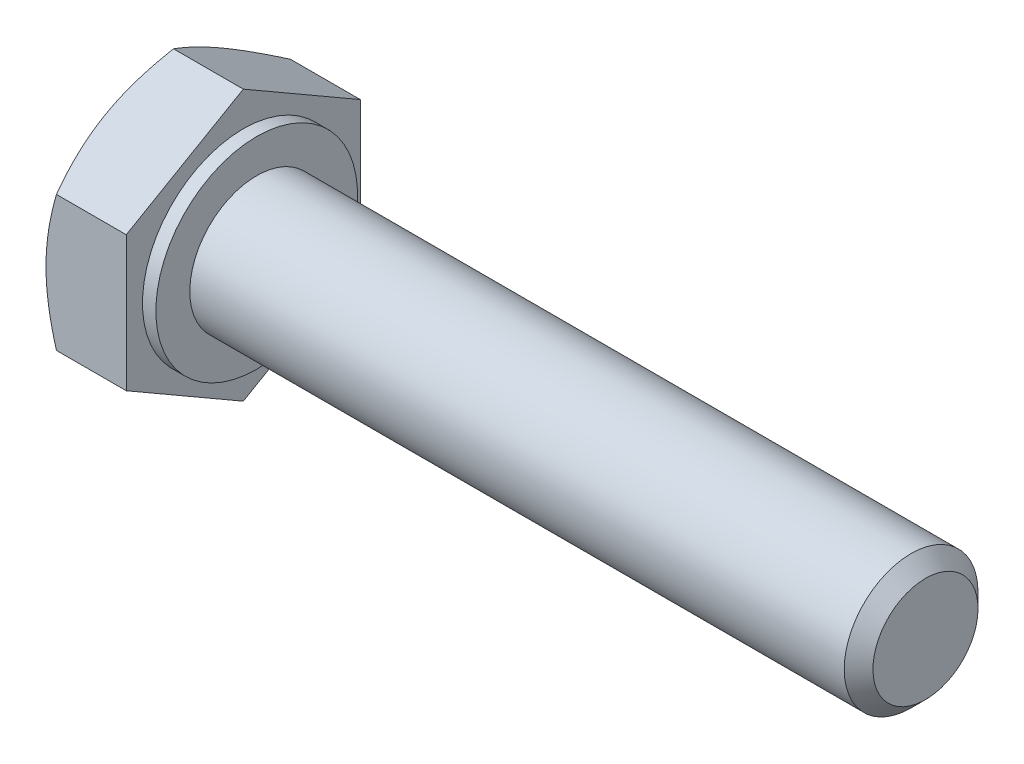
ISO-10303-21;
HEADER;
FILE_DESCRIPTION(('STEP AP214'),'2;1');
FILE_NAME('part.step','',(''),(''),'','','');
FILE_SCHEMA(('AUTOMOTIVE_DESIGN { 1 0 10303 214 1 1 1 1 }'));
ENDSEC;
DATA;
#1=APPLICATION_CONTEXT('core data for automotive mechanical design processes');
#2=APPLICATION_PROTOCOL_DEFINITION('international standard','automotive_design',2000,#1);
#3=PRODUCT_CONTEXT('',#1,'mechanical');
#4=PRODUCT('Part','Part','',(#3));
#5=PRODUCT_RELATED_PRODUCT_CATEGORY('part','',(#4));
#6=PRODUCT_DEFINITION_FORMATION('','',#4);
#7=PRODUCT_DEFINITION_CONTEXT('part definition',#1,'design');
#8=PRODUCT_DEFINITION('design','',#6,#7);
#9=PRODUCT_DEFINITION_SHAPE('','',#8);
#10=(LENGTH_UNIT() NAMED_UNIT(*) SI_UNIT(.MILLI.,.METRE.));
#11=(NAMED_UNIT(*) PLANE_ANGLE_UNIT() SI_UNIT($,.RADIAN.));
#12=(NAMED_UNIT(*) SI_UNIT($,.STERADIAN.) SOLID_ANGLE_UNIT());
#13=UNCERTAINTY_MEASURE_WITH_UNIT(LENGTH_MEASURE(1.E-05),#10,'distance_accuracy_value','');
#14=(GEOMETRIC_REPRESENTATION_CONTEXT(3) GLOBAL_UNCERTAINTY_ASSIGNED_CONTEXT((#13)) GLOBAL_UNIT_ASSIGNED_CONTEXT((#10,
#11,#12)) REPRESENTATION_CONTEXT('',''));
#15=CARTESIAN_POINT('',(0.,0.,0.));
#16=DIRECTION('',(0.,0.,1.));
#17=DIRECTION('',(1.,0.,0.));
#18=AXIS2_PLACEMENT_3D('',#15,#16,#17);
#19=CARTESIAN_POINT('',(0.,2.5075,0.));
#20=DIRECTION('',(1.,0.,0.));
#21=DIRECTION('',(0.,1.,0.));
#22=AXIS2_PLACEMENT_3D('',#19,#20,#21);
#23=PLANE('',#22);
#24=CARTESIAN_POINT('',(0.,0.,0.));
#25=DIRECTION('',(1.,0.,0.));
#26=DIRECTION('',(0.,1.,0.));
#27=AXIS2_PLACEMENT_3D('',#24,#25,#26);
#28=CIRCLE('',#27,2.);
#29=CARTESIAN_POINT('',(0.,-2.,0.));
#30=VERTEX_POINT('',#29);
#31=EDGE_CURVE('E249',#30,#30,#28,.T.);
#32=ORIENTED_EDGE('',*,*,#31,.F.);
#33=EDGE_LOOP('',(#32));
#34=FACE_BOUND('',#33,.T.);
#35=CARTESIAN_POINT('',(0.,0.,0.));
#36=DIRECTION('',(1.,0.,0.));
#37=DIRECTION('',(0.,1.,0.));
#38=AXIS2_PLACEMENT_3D('',#35,#36,#37);
#39=CIRCLE('',#38,3.015);
#40=CARTESIAN_POINT('',(0.,-3.015,0.));
#41=VERTEX_POINT('',#40);
#42=EDGE_CURVE('E30',#41,#41,#39,.T.);
#43=ORIENTED_EDGE('',*,*,#42,.T.);
#44=EDGE_LOOP('',(#43));
#45=FACE_BOUND('',#44,.T.);
#46=ADVANCED_FACE('F17',(#34,#45),#23,.T.);
#47=CARTESIAN_POINT('',(-0.200049999999994,0.,0.));
#48=DIRECTION('',(1.,0.,0.));
#49=DIRECTION('',(0.,1.,0.));
#50=AXIS2_PLACEMENT_3D('',#47,#48,#49);
#51=CYLINDRICAL_SURFACE('',#50,3.015);
#52=ORIENTED_EDGE('',*,*,#42,.F.);
#53=DIRECTION('',(-1.,0.,0.));
#54=VECTOR('',#53,1.);
#55=CARTESIAN_POINT('',(-0.200049999999994,-3.015,0.));
#56=LINE('',#55,#54);
#57=CARTESIAN_POINT('',(-0.400099999999993,-3.015,0.));
#58=VERTEX_POINT('',#57);
#59=EDGE_CURVE('E11',#41,#58,#56,.T.);
#60=ORIENTED_EDGE('',*,*,#59,.T.);
#61=CARTESIAN_POINT('',(-0.400099999999992,0.,0.));
#62=DIRECTION('',(1.,0.,0.));
#63=DIRECTION('',(0.,1.,0.));
#64=AXIS2_PLACEMENT_3D('',#61,#62,#63);
#65=CIRCLE('',#64,3.015);
#66=EDGE_CURVE('E162',#58,#58,#65,.T.);
#67=ORIENTED_EDGE('',*,*,#66,.T.);
#68=ORIENTED_EDGE('',*,*,#59,.F.);
#69=EDGE_LOOP('',(#52,#60,#67,#68));
#70=FACE_BOUND('',#69,.T.);
#71=ADVANCED_FACE('F371',(#70),#51,.T.);
#72=CARTESIAN_POINT('',(-2.8001,0.,0.));
#73=DIRECTION('',(1.,0.,0.));
#74=DIRECTION('',(0.,1.,0.));
#75=AXIS2_PLACEMENT_3D('',#72,#73,#74);
#76=PLANE('',#75);
#77=CARTESIAN_POINT('',(-2.8001,0.,0.));
#78=DIRECTION('',(-1.,0.,0.));
#79=DIRECTION('',(0.,1.,0.));
#80=AXIS2_PLACEMENT_3D('',#77,#78,#79);
#81=CIRCLE('',#80,3.5);
#82=CARTESIAN_POINT('',(-2.8001,0.,3.5));
#83=VERTEX_POINT('',#82);
#84=CARTESIAN_POINT('',(-2.8001,3.03108891324553,1.75));
#85=VERTEX_POINT('',#84);
#86=EDGE_CURVE('E183',#83,#85,#81,.T.);
#87=ORIENTED_EDGE('',*,*,#86,.T.);
#88=CARTESIAN_POINT('',(-2.8001,0.,0.));
#89=DIRECTION('',(-1.,0.,0.));
#90=DIRECTION('',(0.,1.,0.));
#91=AXIS2_PLACEMENT_3D('',#88,#89,#90);
#92=CIRCLE('',#91,3.5);
#93=CARTESIAN_POINT('',(-2.8001,3.03108891324553,-1.75));
#94=VERTEX_POINT('',#93);
#95=EDGE_CURVE('E197',#85,#94,#92,.T.);
#96=ORIENTED_EDGE('',*,*,#95,.T.);
#97=CARTESIAN_POINT('',(-2.8001,0.,0.));
#98=DIRECTION('',(-1.,0.,0.));
#99=DIRECTION('',(0.,1.,0.));
#100=AXIS2_PLACEMENT_3D('',#97,#98,#99);
#101=CIRCLE('',#100,3.5);
#102=CARTESIAN_POINT('',(-2.8001,0.,-3.5));
#103=VERTEX_POINT('',#102);
#104=EDGE_CURVE('E209',#94,#103,#101,.T.);
#105=ORIENTED_EDGE('',*,*,#104,.T.);
#106=CARTESIAN_POINT('',(-2.8001,0.,0.));
#107=DIRECTION('',(-1.,0.,0.));
#108=DIRECTION('',(0.,1.,0.));
#109=AXIS2_PLACEMENT_3D('',#106,#107,#108);
#110=CIRCLE('',#109,3.5);
#111=CARTESIAN_POINT('',(-2.8001,-3.03108891324553,-1.75));
#112=VERTEX_POINT('',#111);
#113=EDGE_CURVE('E103',#103,#112,#110,.T.);
#114=ORIENTED_EDGE('',*,*,#113,.T.);
#115=CARTESIAN_POINT('',(-2.8001,0.,0.));
#116=DIRECTION('',(-1.,0.,0.));
#117=DIRECTION('',(0.,1.,0.));
#118=AXIS2_PLACEMENT_3D('',#115,#116,#117);
#119=CIRCLE('',#118,3.5);
#120=CARTESIAN_POINT('',(-2.8001,-3.03108891324553,1.75));
#121=VERTEX_POINT('',#120);
#122=EDGE_CURVE('E264',#112,#121,#119,.T.);
#123=ORIENTED_EDGE('',*,*,#122,.T.);
#124=CARTESIAN_POINT('',(-2.8001,0.,0.));
#125=DIRECTION('',(-1.,0.,0.));
#126=DIRECTION('',(0.,1.,0.));
#127=AXIS2_PLACEMENT_3D('',#124,#125,#126);
#128=CIRCLE('',#127,3.5);
#129=EDGE_CURVE('E174',#121,#83,#128,.T.);
#130=ORIENTED_EDGE('',*,*,#129,.T.);
#131=EDGE_LOOP('',(#87,#96,#105,#114,#123,#130));
#132=FACE_BOUND('',#131,.T.);
#133=ADVANCED_FACE('F336',(#132),#76,.F.);
#134=CARTESIAN_POINT('',(-0.400099999999993,-4.04145188432738,0.));
#135=DIRECTION('',(0.,-0.866025403784439,-0.5));
#136=DIRECTION('',(0.,0.5,-0.866025403784439));
#137=AXIS2_PLACEMENT_3D('',#134,#135,#136);
#138=PLANE('',#137);
#139=CARTESIAN_POINT('',(-2.8001,-3.03108891324553,-1.75));
#140=CARTESIAN_POINT('',(-2.80010000000001,-2.56217782649107,-2.56217782649106));
#141=CARTESIAN_POINT('',(-2.48749260883037,-2.0207259421637,-3.5));
#142=(BOUNDED_CURVE() B_SPLINE_CURVE(2,(#139,#140,#141),.UNSPECIFIED.,.F.,
.F.) B_SPLINE_CURVE_WITH_KNOTS((3,3),(0.204998401571332,0.409996803142664),
.UNSPECIFIED.) CURVE() GEOMETRIC_REPRESENTATION_ITEM() RATIONAL_B_SPLINE_CURVE((1.,
1.03795484930207,1.)) REPRESENTATION_ITEM(''));
#143=CARTESIAN_POINT('',(-2.48749260883038,-2.0207259421637,-3.5));
#144=VERTEX_POINT('',#143);
#145=EDGE_CURVE('E218',#112,#144,#142,.T.);
#146=ORIENTED_EDGE('',*,*,#145,.T.);
#147=DIRECTION('',(-1.,0.,0.));
#148=VECTOR('',#147,1.);
#149=CARTESIAN_POINT('',(-0.400099999999993,-2.02072594216369,-3.5));
#150=LINE('',#149,#148);
#151=CARTESIAN_POINT('',(-0.400099999999993,-2.02072594216369,-3.5));
#152=VERTEX_POINT('',#151);
#153=EDGE_CURVE('E216',#152,#144,#150,.T.);
#154=ORIENTED_EDGE('',*,*,#153,.F.);
#155=DIRECTION('',(0.,0.5,-0.866025403784439));
#156=VECTOR('',#155,1.);
#157=CARTESIAN_POINT('',(-0.400099999999993,-4.04145188432738,0.));
#158=LINE('',#157,#156);
#159=CARTESIAN_POINT('',(-0.400099999999993,-4.04145188432738,0.));
#160=VERTEX_POINT('',#159);
#161=EDGE_CURVE('E136',#160,#152,#158,.T.);
#162=ORIENTED_EDGE('',*,*,#161,.F.);
#163=DIRECTION('',(-1.,0.,0.));
#164=VECTOR('',#163,1.);
#165=CARTESIAN_POINT('',(-0.400099999999993,-4.04145188432738,0.));
#166=LINE('',#165,#164);
#167=CARTESIAN_POINT('',(-2.48749260883038,-4.04145188432736,0.));
#168=VERTEX_POINT('',#167);
#169=EDGE_CURVE('E161',#160,#168,#166,.T.);
#170=ORIENTED_EDGE('',*,*,#169,.T.);
#171=CARTESIAN_POINT('',(-2.48749260883038,-4.04145188432736,0.));
#172=CARTESIAN_POINT('',(-2.80010000000001,-3.49999999999999,-0.937822173508942));
#173=CARTESIAN_POINT('',(-2.8001,-3.03108891324553,-1.75));
#174=(BOUNDED_CURVE() B_SPLINE_CURVE(2,(#171,#172,#173),.UNSPECIFIED.,.F.,
.F.) B_SPLINE_CURVE_WITH_KNOTS((3,3),(0.,0.204998401571332),
.UNSPECIFIED.) CURVE() GEOMETRIC_REPRESENTATION_ITEM() RATIONAL_B_SPLINE_CURVE((1.,
1.03795484930205,1.)) REPRESENTATION_ITEM(''));
#175=EDGE_CURVE('E241',#168,#112,#174,.T.);
#176=ORIENTED_EDGE('',*,*,#175,.T.);
#177=EDGE_LOOP('',(#146,#154,#162,#170,#176));
#178=FACE_BOUND('',#177,.T.);
#179=ADVANCED_FACE('F388',(#178),#138,.T.);
#180=CARTESIAN_POINT('',(-0.400099999999993,-2.02072594216369,3.5));
#181=DIRECTION('',(0.,-0.866025403784439,0.5));
#182=DIRECTION('',(-1.,0.,0.));
#183=AXIS2_PLACEMENT_3D('',#180,#181,#182);
#184=PLANE('',#183);
#185=CARTESIAN_POINT('',(-2.8001,-3.03108891324553,1.75));
#186=CARTESIAN_POINT('',(-2.80010000000001,-3.49999999999999,0.937822173508936));
#187=CARTESIAN_POINT('',(-2.48749260883038,-4.04145188432736,0.));
#188=(BOUNDED_CURVE() B_SPLINE_CURVE(2,(#185,#186,#187),.UNSPECIFIED.,.F.,
.F.) B_SPLINE_CURVE_WITH_KNOTS((3,3),(0.204998401571332,0.409996803142664),
.UNSPECIFIED.) CURVE() GEOMETRIC_REPRESENTATION_ITEM() RATIONAL_B_SPLINE_CURVE((1.,
1.03795484930205,1.)) REPRESENTATION_ITEM(''));
#189=EDGE_CURVE('E21',#121,#168,#188,.T.);
#190=ORIENTED_EDGE('',*,*,#189,.T.);
#191=ORIENTED_EDGE('',*,*,#169,.F.);
#192=DIRECTION('',(0.,-0.5,-0.866025403784439));
#193=VECTOR('',#192,1.);
#194=CARTESIAN_POINT('',(-0.400099999999993,-2.02072594216369,3.5));
#195=LINE('',#194,#193);
#196=CARTESIAN_POINT('',(-0.400099999999993,-2.02072594216369,3.5));
#197=VERTEX_POINT('',#196);
#198=EDGE_CURVE('E157',#197,#160,#195,.T.);
#199=ORIENTED_EDGE('',*,*,#198,.F.);
#200=DIRECTION('',(-1.,0.,0.));
#201=VECTOR('',#200,1.);
#202=CARTESIAN_POINT('',(-0.400099999999993,-2.02072594216369,3.5));
#203=LINE('',#202,#201);
#204=CARTESIAN_POINT('',(-2.48749260883038,-2.02072594216366,3.5));
#205=VERTEX_POINT('',#204);
#206=EDGE_CURVE('E151',#197,#205,#203,.T.);
#207=ORIENTED_EDGE('',*,*,#206,.T.);
#208=CARTESIAN_POINT('',(-2.48749260883038,-2.02072594216371,3.5));
#209=CARTESIAN_POINT('',(-2.80010000000001,-2.56217782649108,2.56217782649106));
#210=CARTESIAN_POINT('',(-2.8001,-3.03108891324553,1.75));
#211=(BOUNDED_CURVE() B_SPLINE_CURVE(2,(#208,#209,#210),.UNSPECIFIED.,.F.,
.F.) B_SPLINE_CURVE_WITH_KNOTS((3,3),(0.,0.204998401571332),
.UNSPECIFIED.) CURVE() GEOMETRIC_REPRESENTATION_ITEM() RATIONAL_B_SPLINE_CURVE((1.,
1.03795484930205,1.)) REPRESENTATION_ITEM(''));
#212=EDGE_CURVE('E156',#205,#121,#211,.T.);
#213=ORIENTED_EDGE('',*,*,#212,.T.);
#214=EDGE_LOOP('',(#190,#191,#199,#207,#213));
#215=FACE_BOUND('',#214,.T.);
#216=ADVANCED_FACE('F154',(#215),#184,.T.);
#217=CARTESIAN_POINT('',(-0.400099999999994,2.02072594216369,3.5));
#218=DIRECTION('',(0.,0.,1.));
#219=DIRECTION('',(0.,-1.,0.));
#220=AXIS2_PLACEMENT_3D('',#217,#218,#219);
#221=PLANE('',#220);
#222=CARTESIAN_POINT('',(-2.8001,0.,3.5));
#223=CARTESIAN_POINT('',(-2.80010000000001,-0.937822173508923,3.5));
#224=CARTESIAN_POINT('',(-2.48749260883038,-2.02072594216366,3.5));
#225=(BOUNDED_CURVE() B_SPLINE_CURVE(2,(#222,#223,#224),.UNSPECIFIED.,.F.,
.F.) B_SPLINE_CURVE_WITH_KNOTS((3,3),(0.204998401571332,0.409996803142664),
.UNSPECIFIED.) CURVE() GEOMETRIC_REPRESENTATION_ITEM() RATIONAL_B_SPLINE_CURVE((1.,
1.03795484930203,1.)) REPRESENTATION_ITEM(''));
#226=EDGE_CURVE('E166',#83,#205,#225,.T.);
#227=ORIENTED_EDGE('',*,*,#226,.T.);
#228=ORIENTED_EDGE('',*,*,#206,.F.);
#229=DIRECTION('',(0.,-1.,0.));
#230=VECTOR('',#229,1.);
#231=CARTESIAN_POINT('',(-0.400099999999994,2.02072594216369,3.5));
#232=LINE('',#231,#230);
#233=CARTESIAN_POINT('',(-0.400099999999994,2.02072594216369,3.5));
#234=VERTEX_POINT('',#233);
#235=EDGE_CURVE('E224',#234,#197,#232,.T.);
#236=ORIENTED_EDGE('',*,*,#235,.F.);
#237=DIRECTION('',(-1.,0.,0.));
#238=VECTOR('',#237,1.);
#239=CARTESIAN_POINT('',(-0.400099999999994,2.02072594216369,3.5));
#240=LINE('',#239,#238);
#241=CARTESIAN_POINT('',(-2.48749260883038,2.02072594216366,3.5));
#242=VERTEX_POINT('',#241);
#243=EDGE_CURVE('E325',#234,#242,#240,.T.);
#244=ORIENTED_EDGE('',*,*,#243,.T.);
#245=CARTESIAN_POINT('',(-2.48749260883037,2.02072594216366,3.5));
#246=CARTESIAN_POINT('',(-2.80010000000001,0.937822173508917,3.5));
#247=CARTESIAN_POINT('',(-2.8001,0.,3.5));
#248=(BOUNDED_CURVE() B_SPLINE_CURVE(2,(#245,#246,#247),.UNSPECIFIED.,.F.,
.F.) B_SPLINE_CURVE_WITH_KNOTS((3,3),(0.,0.204998401571332),
.UNSPECIFIED.) CURVE() GEOMETRIC_REPRESENTATION_ITEM() RATIONAL_B_SPLINE_CURVE((1.,
1.03795484930204,1.)) REPRESENTATION_ITEM(''));
#249=EDGE_CURVE('E169',#242,#83,#248,.T.);
#250=ORIENTED_EDGE('',*,*,#249,.T.);
#251=EDGE_LOOP('',(#227,#228,#236,#244,#250));
#252=FACE_BOUND('',#251,.T.);
#253=ADVANCED_FACE('F167',(#252),#221,.T.);
#254=CARTESIAN_POINT('',(-0.400099999999993,0.,0.));
#255=DIRECTION('',(1.,0.,0.));
#256=DIRECTION('',(0.,1.,0.));
#257=AXIS2_PLACEMENT_3D('',#254,#255,#256);
#258=PLANE('',#257);
#259=ORIENTED_EDGE('',*,*,#66,.F.);
#260=EDGE_LOOP('',(#259));
#261=FACE_BOUND('',#260,.T.);
#262=DIRECTION('',(0.,-0.5,0.866025403784438));
#263=VECTOR('',#262,1.);
#264=CARTESIAN_POINT('',(-0.400099999999994,4.04145188432738,0.));
#265=LINE('',#264,#263);
#266=CARTESIAN_POINT('',(-0.400099999999994,4.04145188432738,0.));
#267=VERTEX_POINT('',#266);
#268=EDGE_CURVE('E124',#267,#234,#265,.T.);
#269=ORIENTED_EDGE('',*,*,#268,.T.);
#270=ORIENTED_EDGE('',*,*,#235,.T.);
#271=ORIENTED_EDGE('',*,*,#198,.T.);
#272=ORIENTED_EDGE('',*,*,#161,.T.);
#273=DIRECTION('',(0.,1.,0.));
#274=VECTOR('',#273,1.);
#275=CARTESIAN_POINT('',(-0.400099999999993,-2.02072594216369,-3.5));
#276=LINE('',#275,#274);
#277=CARTESIAN_POINT('',(-0.400099999999994,2.02072594216369,-3.5));
#278=VERTEX_POINT('',#277);
#279=EDGE_CURVE('E210',#152,#278,#276,.T.);
#280=ORIENTED_EDGE('',*,*,#279,.T.);
#281=DIRECTION('',(0.,0.5,0.866025403784439));
#282=VECTOR('',#281,1.);
#283=CARTESIAN_POINT('',(-0.400099999999994,2.02072594216369,-3.5));
#284=LINE('',#283,#282);
#285=EDGE_CURVE('E317',#278,#267,#284,.T.);
#286=ORIENTED_EDGE('',*,*,#285,.T.);
#287=EDGE_LOOP('',(#269,#270,#271,#272,#280,#286));
#288=FACE_BOUND('',#287,.T.);
#289=ADVANCED_FACE('F19',(#261,#288),#258,.T.);
#290=CARTESIAN_POINT('',(-0.400099999999994,4.04145188432738,0.));
#291=DIRECTION('',(0.,0.866025403784438,0.5));
#292=DIRECTION('',(1.,0.,0.));
#293=AXIS2_PLACEMENT_3D('',#290,#291,#292);
#294=PLANE('',#293);
#295=CARTESIAN_POINT('',(-2.48749260883038,4.04145188432736,0.));
#296=CARTESIAN_POINT('',(-2.80010000000001,3.49999999999999,0.937822173508938));
#297=CARTESIAN_POINT('',(-2.8001,3.03108891324553,1.75));
#298=(BOUNDED_CURVE() B_SPLINE_CURVE(2,(#295,#296,#297),.UNSPECIFIED.,.F.,
.F.) B_SPLINE_CURVE_WITH_KNOTS((3,3),(0.,0.204998401571332),
.UNSPECIFIED.) CURVE() GEOMETRIC_REPRESENTATION_ITEM() RATIONAL_B_SPLINE_CURVE((1.,
1.03795484930204,1.)) REPRESENTATION_ITEM(''));
#299=CARTESIAN_POINT('',(-2.48749260883038,4.04145188432736,0.));
#300=VERTEX_POINT('',#299);
#301=EDGE_CURVE('E201',#300,#85,#298,.T.);
#302=ORIENTED_EDGE('',*,*,#301,.T.);
#303=CARTESIAN_POINT('',(-2.8001,3.03108891324553,1.75));
#304=CARTESIAN_POINT('',(-2.80010000000001,2.56217782649107,2.56217782649106));
#305=CARTESIAN_POINT('',(-2.48749260883038,2.0207259421637,3.5));
#306=(BOUNDED_CURVE() B_SPLINE_CURVE(2,(#303,#304,#305),.UNSPECIFIED.,.F.,
.F.) B_SPLINE_CURVE_WITH_KNOTS((3,3),(0.204998401571332,0.409996803142664),
.UNSPECIFIED.) CURVE() GEOMETRIC_REPRESENTATION_ITEM() RATIONAL_B_SPLINE_CURVE((1.,
1.03795484930205,1.)) REPRESENTATION_ITEM(''));
#307=EDGE_CURVE('E196',#85,#242,#306,.T.);
#308=ORIENTED_EDGE('',*,*,#307,.T.);
#309=ORIENTED_EDGE('',*,*,#243,.F.);
#310=ORIENTED_EDGE('',*,*,#268,.F.);
#311=DIRECTION('',(-1.,0.,0.));
#312=VECTOR('',#311,1.);
#313=CARTESIAN_POINT('',(-0.400099999999994,4.04145188432738,0.));
#314=LINE('',#313,#312);
#315=EDGE_CURVE('E314',#267,#300,#314,.T.);
#316=ORIENTED_EDGE('',*,*,#315,.T.);
#317=EDGE_LOOP('',(#302,#308,#309,#310,#316));
#318=FACE_BOUND('',#317,.T.);
#319=ADVANCED_FACE('F332',(#318),#294,.T.);
#320=CARTESIAN_POINT('',(-0.400099999999994,2.02072594216369,-3.5));
#321=DIRECTION('',(0.,0.866025403784439,-0.5));
#322=DIRECTION('',(-1.,0.,0.));
#323=AXIS2_PLACEMENT_3D('',#320,#321,#322);
#324=PLANE('',#323);
#325=CARTESIAN_POINT('',(-2.48749260883038,2.0207259421637,-3.5));
#326=CARTESIAN_POINT('',(-2.80010000000001,2.56217782649108,-2.56217782649105));
#327=CARTESIAN_POINT('',(-2.8001,3.03108891324553,-1.75));
#328=(BOUNDED_CURVE() B_SPLINE_CURVE(2,(#325,#326,#327),.UNSPECIFIED.,.F.,
.F.) B_SPLINE_CURVE_WITH_KNOTS((3,3),(0.,0.204998401571332),
.UNSPECIFIED.) CURVE() GEOMETRIC_REPRESENTATION_ITEM() RATIONAL_B_SPLINE_CURVE((1.,
1.03795484930204,1.)) REPRESENTATION_ITEM(''));
#329=CARTESIAN_POINT('',(-2.48749260883038,2.02072594216366,-3.5));
#330=VERTEX_POINT('',#329);
#331=EDGE_CURVE('E203',#330,#94,#328,.T.);
#332=ORIENTED_EDGE('',*,*,#331,.T.);
#333=CARTESIAN_POINT('',(-2.8001,3.03108891324553,-1.75));
#334=CARTESIAN_POINT('',(-2.80010000000001,3.49999999999999,-0.937822173508939));
#335=CARTESIAN_POINT('',(-2.48749260883038,4.04145188432736,0.));
#336=(BOUNDED_CURVE() B_SPLINE_CURVE(2,(#333,#334,#335),.UNSPECIFIED.,.F.,
.F.) B_SPLINE_CURVE_WITH_KNOTS((3,3),(0.204998401571332,0.409996803142665),
.UNSPECIFIED.) CURVE() GEOMETRIC_REPRESENTATION_ITEM() RATIONAL_B_SPLINE_CURVE((1.,
1.03795484930206,1.)) REPRESENTATION_ITEM(''));
#337=EDGE_CURVE('E202',#94,#300,#336,.T.);
#338=ORIENTED_EDGE('',*,*,#337,.T.);
#339=ORIENTED_EDGE('',*,*,#315,.F.);
#340=ORIENTED_EDGE('',*,*,#285,.F.);
#341=DIRECTION('',(-1.,0.,0.));
#342=VECTOR('',#341,1.);
#343=CARTESIAN_POINT('',(-0.400099999999994,2.02072594216369,-3.5));
#344=LINE('',#343,#342);
#345=EDGE_CURVE('E217',#278,#330,#344,.T.);
#346=ORIENTED_EDGE('',*,*,#345,.T.);
#347=EDGE_LOOP('',(#332,#338,#339,#340,#346));
#348=FACE_BOUND('',#347,.T.);
#349=ADVANCED_FACE('F479',(#348),#324,.T.);
#350=CARTESIAN_POINT('',(-0.400099999999993,-2.02072594216369,-3.5));
#351=DIRECTION('',(0.,0.,-1.));
#352=DIRECTION('',(-1.,0.,0.));
#353=AXIS2_PLACEMENT_3D('',#350,#351,#352);
#354=PLANE('',#353);
#355=CARTESIAN_POINT('',(-2.48749260883038,-2.02072594216366,-3.5));
#356=CARTESIAN_POINT('',(-2.80010000000001,-0.937822173508916,-3.5));
#357=CARTESIAN_POINT('',(-2.8001,0.,-3.5));
#358=(BOUNDED_CURVE() B_SPLINE_CURVE(2,(#355,#356,#357),.UNSPECIFIED.,.F.,
.F.) B_SPLINE_CURVE_WITH_KNOTS((3,3),(0.,0.204998401571332),
.UNSPECIFIED.) CURVE() GEOMETRIC_REPRESENTATION_ITEM() RATIONAL_B_SPLINE_CURVE((1.,
1.03795484930204,1.)) REPRESENTATION_ITEM(''));
#359=EDGE_CURVE('E208',#144,#103,#358,.T.);
#360=ORIENTED_EDGE('',*,*,#359,.T.);
#361=CARTESIAN_POINT('',(-2.8001,0.,-3.5));
#362=CARTESIAN_POINT('',(-2.80010000000001,0.937822173508917,-3.5));
#363=CARTESIAN_POINT('',(-2.48749260883038,2.02072594216366,-3.5));
#364=(BOUNDED_CURVE() B_SPLINE_CURVE(2,(#361,#362,#363),.UNSPECIFIED.,.F.,
.F.) B_SPLINE_CURVE_WITH_KNOTS((3,3),(0.204998401571332,0.409996803142664),
.UNSPECIFIED.) CURVE() GEOMETRIC_REPRESENTATION_ITEM() RATIONAL_B_SPLINE_CURVE((1.,
1.03795484930204,1.)) REPRESENTATION_ITEM(''));
#365=EDGE_CURVE('E258',#103,#330,#364,.T.);
#366=ORIENTED_EDGE('',*,*,#365,.T.);
#367=ORIENTED_EDGE('',*,*,#345,.F.);
#368=ORIENTED_EDGE('',*,*,#279,.F.);
#369=ORIENTED_EDGE('',*,*,#153,.T.);
#370=EDGE_LOOP('',(#360,#366,#367,#368,#369));
#371=FACE_BOUND('',#370,.T.);
#372=ADVANCED_FACE('F487',(#371),#354,.T.);
#373=CARTESIAN_POINT('',(-2.64379630441519,0.,0.));
#374=DIRECTION('',(1.,0.,0.));
#375=DIRECTION('',(0.,1.,0.));
#376=AXIS2_PLACEMENT_3D('',#373,#374,#375);
#377=CONICAL_SURFACE('',#376,3.77072594216368,1.0471975511966);
#378=ORIENTED_EDGE('',*,*,#359,.F.);
#379=ORIENTED_EDGE('',*,*,#145,.F.);
#380=ORIENTED_EDGE('',*,*,#113,.F.);
#381=EDGE_LOOP('',(#378,#379,#380));
#382=FACE_BOUND('',#381,.T.);
#383=ADVANCED_FACE('F495',(#382),#377,.T.);
#384=CARTESIAN_POINT('',(-2.64379630441519,0.,0.));
#385=DIRECTION('',(1.,0.,0.));
#386=DIRECTION('',(0.,1.,0.));
#387=AXIS2_PLACEMENT_3D('',#384,#385,#386);
#388=CONICAL_SURFACE('',#387,3.77072594216368,1.0471975511966);
#389=ORIENTED_EDGE('',*,*,#365,.F.);
#390=ORIENTED_EDGE('',*,*,#104,.F.);
#391=ORIENTED_EDGE('',*,*,#331,.F.);
#392=EDGE_LOOP('',(#389,#390,#391));
#393=FACE_BOUND('',#392,.T.);
#394=ADVANCED_FACE('F380',(#393),#388,.T.);
#395=CARTESIAN_POINT('',(-2.64379630441519,0.,0.));
#396=DIRECTION('',(1.,0.,0.));
#397=DIRECTION('',(0.,-1.,0.));
#398=AXIS2_PLACEMENT_3D('',#395,#396,#397);
#399=CONICAL_SURFACE('',#398,3.77072594216368,1.0471975511966);
#400=ORIENTED_EDGE('',*,*,#175,.F.);
#401=ORIENTED_EDGE('',*,*,#189,.F.);
#402=ORIENTED_EDGE('',*,*,#122,.F.);
#403=EDGE_LOOP('',(#400,#401,#402));
#404=FACE_BOUND('',#403,.T.);
#405=ADVANCED_FACE('F386',(#404),#399,.T.);
#406=CARTESIAN_POINT('',(-2.64379630441519,0.,0.));
#407=DIRECTION('',(1.,0.,0.));
#408=DIRECTION('',(0.,1.,0.));
#409=AXIS2_PLACEMENT_3D('',#406,#407,#408);
#410=CONICAL_SURFACE('',#409,3.77072594216368,1.0471975511966);
#411=ORIENTED_EDGE('',*,*,#337,.F.);
#412=ORIENTED_EDGE('',*,*,#95,.F.);
#413=ORIENTED_EDGE('',*,*,#301,.F.);
#414=EDGE_LOOP('',(#411,#412,#413));
#415=FACE_BOUND('',#414,.T.);
#416=ADVANCED_FACE('F383',(#415),#410,.T.);
#417=CARTESIAN_POINT('',(-2.64379630441519,0.,0.));
#418=DIRECTION('',(1.,0.,0.));
#419=DIRECTION('',(0.,1.,0.));
#420=AXIS2_PLACEMENT_3D('',#417,#418,#419);
#421=CONICAL_SURFACE('',#420,3.77072594216368,1.0471975511966);
#422=ORIENTED_EDGE('',*,*,#212,.F.);
#423=ORIENTED_EDGE('',*,*,#226,.F.);
#424=ORIENTED_EDGE('',*,*,#129,.F.);
#425=EDGE_LOOP('',(#422,#423,#424));
#426=FACE_BOUND('',#425,.T.);
#427=ADVANCED_FACE('F176',(#426),#421,.T.);
#428=CARTESIAN_POINT('',(-2.64379630441519,0.,0.));
#429=DIRECTION('',(1.,0.,0.));
#430=DIRECTION('',(0.,1.,0.));
#431=AXIS2_PLACEMENT_3D('',#428,#429,#430);
#432=CONICAL_SURFACE('',#431,3.77072594216368,1.0471975511966);
#433=ORIENTED_EDGE('',*,*,#307,.F.);
#434=ORIENTED_EDGE('',*,*,#86,.F.);
#435=ORIENTED_EDGE('',*,*,#249,.F.);
#436=EDGE_LOOP('',(#433,#434,#435));
#437=FACE_BOUND('',#436,.T.);
#438=ADVANCED_FACE('F335',(#437),#432,.T.);
#439=CARTESIAN_POINT('',(20.,1.,0.));
#440=DIRECTION('',(1.,0.,0.));
#441=DIRECTION('',(0.,1.,0.));
#442=AXIS2_PLACEMENT_3D('',#439,#440,#441);
#443=PLANE('',#442);
#444=CARTESIAN_POINT('',(20.,0.,0.));
#445=DIRECTION('',(-1.,0.,0.));
#446=DIRECTION('',(0.,-1.,0.));
#447=AXIS2_PLACEMENT_3D('',#444,#445,#446);
#448=CIRCLE('',#447,1.570585);
#449=CARTESIAN_POINT('',(20.,1.570585,0.));
#450=VERTEX_POINT('',#449);
#451=EDGE_CURVE('E255',#450,#450,#448,.T.);
#452=ORIENTED_EDGE('',*,*,#451,.F.);
#453=EDGE_LOOP('',(#452));
#454=FACE_BOUND('',#453,.T.);
#455=ADVANCED_FACE('F358',(#454),#443,.T.);
#456=CARTESIAN_POINT('',(11.05,0.,0.));
#457=DIRECTION('',(1.,0.,0.));
#458=DIRECTION('',(0.,1.,0.));
#459=AXIS2_PLACEMENT_3D('',#456,#457,#458);
#460=CYLINDRICAL_SURFACE('',#459,2.);
#461=CARTESIAN_POINT('',(19.570485,0.,0.));
#462=DIRECTION('',(1.,0.,0.));
#463=DIRECTION('',(0.,-1.,0.));
#464=AXIS2_PLACEMENT_3D('',#461,#462,#463);
#465=CIRCLE('',#464,2.);
#466=CARTESIAN_POINT('',(19.570485,2.,0.));
#467=VERTEX_POINT('',#466);
#468=CARTESIAN_POINT('',(19.570485,-2.,0.));
#469=VERTEX_POINT('',#468);
#470=EDGE_CURVE('E230',#467,#469,#465,.T.);
#471=ORIENTED_EDGE('',*,*,#470,.F.);
#472=CARTESIAN_POINT('',(19.570485,0.,0.));
#473=DIRECTION('',(1.,0.,0.));
#474=DIRECTION('',(0.,-1.,0.));
#475=AXIS2_PLACEMENT_3D('',#472,#473,#474);
#476=CIRCLE('',#475,2.);
#477=EDGE_CURVE('E234',#469,#467,#476,.T.);
#478=ORIENTED_EDGE('',*,*,#477,.F.);
#479=DIRECTION('',(-1.,0.,0.));
#480=VECTOR('',#479,1.);
#481=CARTESIAN_POINT('',(11.05,-2.,0.));
#482=LINE('',#481,#480);
#483=EDGE_CURVE('E242',#469,#30,#482,.T.);
#484=ORIENTED_EDGE('',*,*,#483,.T.);
#485=ORIENTED_EDGE('',*,*,#31,.T.);
#486=ORIENTED_EDGE('',*,*,#483,.F.);
#487=EDGE_LOOP('',(#471,#478,#484,#485,#486));
#488=FACE_BOUND('',#487,.T.);
#489=ADVANCED_FACE('F349',(#488),#460,.T.);
#490=CARTESIAN_POINT('',(19.7852425,0.,0.));
#491=DIRECTION('',(-1.,0.,0.));
#492=DIRECTION('',(0.,-1.,0.));
#493=AXIS2_PLACEMENT_3D('',#490,#491,#492);
#494=CONICAL_SURFACE('',#493,1.7852925,0.785281739475185);
#495=ORIENTED_EDGE('',*,*,#451,.T.);
#496=DIRECTION('',(-0.707189100539036,0.707024452249559,0.));
#497=VECTOR('',#496,1.);
#498=CARTESIAN_POINT('',(19.7852425,1.7852925,0.));
#499=LINE('',#498,#497);
#500=EDGE_CURVE('E235',#450,#467,#499,.T.);
#501=ORIENTED_EDGE('',*,*,#500,.T.);
#502=ORIENTED_EDGE('',*,*,#470,.T.);
#503=ORIENTED_EDGE('',*,*,#477,.T.);
#504=ORIENTED_EDGE('',*,*,#500,.F.);
#505=EDGE_LOOP('',(#495,#501,#502,#503,#504));
#506=FACE_BOUND('',#505,.T.);
#507=ADVANCED_FACE('F352',(#506),#494,.T.);
#508=CLOSED_SHELL('',(#46,#71,#133,#179,#216,#253,#289,#319,#349,#372,#383,#394,#405,#416,#427,
#438,#455,#489,#507));
#509=MANIFOLD_SOLID_BREP('B1',#508);
#510=ADVANCED_BREP_SHAPE_REPRESENTATION('',(#18,#509),#14);
#511=SHAPE_DEFINITION_REPRESENTATION(#9,#510);
ENDSEC;
END-ISO-10303-21;
